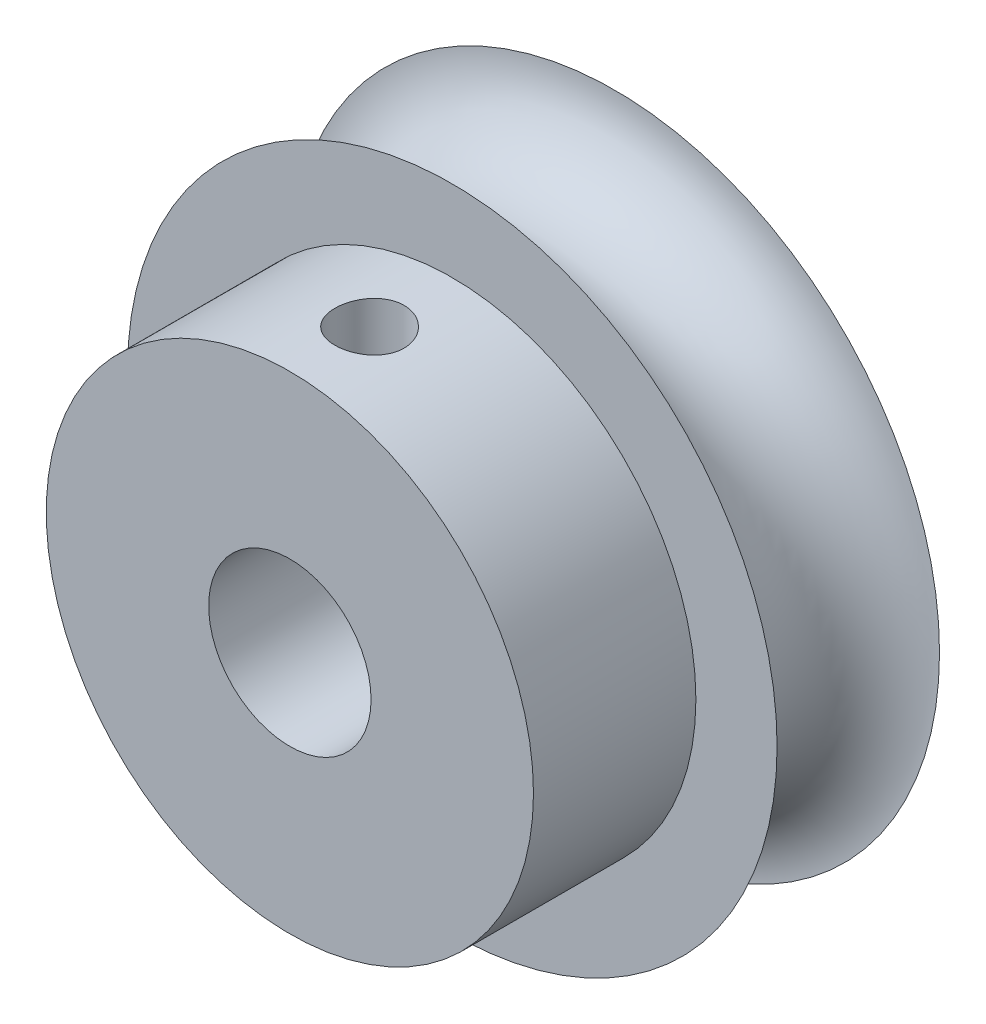
ISO-10303-21;
HEADER;
FILE_DESCRIPTION(('STEP AP214'),'2;1');
FILE_NAME('part.step','',(''),(''),'','','');
FILE_SCHEMA(('AUTOMOTIVE_DESIGN { 1 0 10303 214 1 1 1 1 }'));
ENDSEC;
DATA;
#1=APPLICATION_CONTEXT('core data for automotive mechanical design processes');
#2=APPLICATION_PROTOCOL_DEFINITION('international standard','automotive_design',2000,#1);
#3=PRODUCT_CONTEXT('',#1,'mechanical');
#4=PRODUCT('Part','Part','',(#3));
#5=PRODUCT_RELATED_PRODUCT_CATEGORY('part','',(#4));
#6=PRODUCT_DEFINITION_FORMATION('','',#4);
#7=PRODUCT_DEFINITION_CONTEXT('part definition',#1,'design');
#8=PRODUCT_DEFINITION('design','',#6,#7);
#9=PRODUCT_DEFINITION_SHAPE('','',#8);
#10=(LENGTH_UNIT() NAMED_UNIT(*) SI_UNIT(.MILLI.,.METRE.));
#11=(NAMED_UNIT(*) PLANE_ANGLE_UNIT() SI_UNIT($,.RADIAN.));
#12=(NAMED_UNIT(*) SI_UNIT($,.STERADIAN.) SOLID_ANGLE_UNIT());
#13=UNCERTAINTY_MEASURE_WITH_UNIT(LENGTH_MEASURE(1.E-05),#10,'distance_accuracy_value','');
#14=(GEOMETRIC_REPRESENTATION_CONTEXT(3) GLOBAL_UNCERTAINTY_ASSIGNED_CONTEXT((#13)) GLOBAL_UNIT_ASSIGNED_CONTEXT((#10,
#11,#12)) REPRESENTATION_CONTEXT('',''));
#15=CARTESIAN_POINT('',(0.,0.,0.));
#16=DIRECTION('',(0.,0.,1.));
#17=DIRECTION('',(1.,0.,0.));
#18=AXIS2_PLACEMENT_3D('',#15,#16,#17);
#19=CARTESIAN_POINT('',(0.,0.,6.35));
#20=DIRECTION('',(0.,0.,1.));
#21=DIRECTION('',(1.,0.,0.));
#22=AXIS2_PLACEMENT_3D('',#19,#20,#21);
#23=PLANE('',#22);
#24=CARTESIAN_POINT('',(0.,0.,6.35));
#25=DIRECTION('',(0.,0.,-1.));
#26=DIRECTION('',(-1.,0.,0.));
#27=AXIS2_PLACEMENT_3D('',#24,#25,#26);
#28=CIRCLE('',#27,12.7);
#29=CARTESIAN_POINT('',(-12.7,0.,6.35));
#30=VERTEX_POINT('',#29);
#31=EDGE_CURVE('E51',#30,#30,#28,.T.);
#32=ORIENTED_EDGE('',*,*,#31,.F.);
#33=EDGE_LOOP('',(#32));
#34=FACE_BOUND('',#33,.T.);
#35=CARTESIAN_POINT('',(0.,0.,6.35));
#36=DIRECTION('',(0.,0.,1.));
#37=DIRECTION('',(1.,0.,0.));
#38=AXIS2_PLACEMENT_3D('',#35,#36,#37);
#39=CIRCLE('',#38,9.525);
#40=CARTESIAN_POINT('',(9.525,0.,6.35));
#41=VERTEX_POINT('',#40);
#42=EDGE_CURVE('E39',#41,#41,#39,.T.);
#43=ORIENTED_EDGE('',*,*,#42,.F.);
#44=EDGE_LOOP('',(#43));
#45=FACE_BOUND('',#44,.T.);
#46=ADVANCED_FACE('F35',(#34,#45),#23,.T.);
#47=CARTESIAN_POINT('',(0.,0.,0.));
#48=DIRECTION('',(0.,0.,1.));
#49=DIRECTION('',(1.,0.,0.));
#50=AXIS2_PLACEMENT_3D('',#47,#48,#49);
#51=PLANE('',#50);
#52=CARTESIAN_POINT('',(0.,0.,0.));
#53=DIRECTION('',(0.,0.,1.));
#54=DIRECTION('',(1.,0.,0.));
#55=AXIS2_PLACEMENT_3D('',#52,#53,#54);
#56=CIRCLE('',#55,3.175);
#57=CARTESIAN_POINT('',(3.175,0.,0.));
#58=VERTEX_POINT('',#57);
#59=EDGE_CURVE('E46',#58,#58,#56,.T.);
#60=ORIENTED_EDGE('',*,*,#59,.T.);
#61=EDGE_LOOP('',(#60));
#62=FACE_BOUND('',#61,.T.);
#63=CARTESIAN_POINT('',(0.,0.,0.));
#64=DIRECTION('',(0.,0.,-1.));
#65=DIRECTION('',(-1.,0.,0.));
#66=AXIS2_PLACEMENT_3D('',#63,#64,#65);
#67=CIRCLE('',#66,12.7);
#68=CARTESIAN_POINT('',(-12.7,0.,0.));
#69=VERTEX_POINT('',#68);
#70=EDGE_CURVE('E56',#69,#69,#67,.T.);
#71=ORIENTED_EDGE('',*,*,#70,.T.);
#72=EDGE_LOOP('',(#71));
#73=FACE_BOUND('',#72,.T.);
#74=ADVANCED_FACE('F37',(#62,#73),#51,.F.);
#75=CARTESIAN_POINT('',(0.,0.,12.7));
#76=DIRECTION('',(0.,0.,-1.));
#77=DIRECTION('',(-1.,0.,0.));
#78=AXIS2_PLACEMENT_3D('',#75,#76,#77);
#79=CYLINDRICAL_SURFACE('',#78,9.525);
#80=CARTESIAN_POINT('',(-1.35255009270989,9.42847990116702,9.58400460400663));
#81=CARTESIAN_POINT('',(-1.35254693846715,9.42848111046918,9.5084433362623));
#82=CARTESIAN_POINT('',(-1.34619676177158,9.4293980626598,9.43283706135525));
#83=CARTESIAN_POINT('',(-1.32096869667658,9.4329646859939,9.28373507057906));
#84=CARTESIAN_POINT('',(-1.30207829311546,9.43561608808193,9.21024153975478));
#85=CARTESIAN_POINT('',(-1.25234347946995,9.44234538590909,9.0675450153106));
#86=CARTESIAN_POINT('',(-1.22150788275105,9.44642222971768,8.99833890192684));
#87=CARTESIAN_POINT('',(-1.14877814524653,9.45554179913665,8.86609405733709));
#88=CARTESIAN_POINT('',(-1.10688565122425,9.46058438088382,8.80305440964081));
#89=CARTESIAN_POINT('',(-1.01290948818475,9.47110779325562,8.68446808434494));
#90=CARTESIAN_POINT('',(-0.960762073230853,9.47659123135175,8.62897214880148));
#91=CARTESIAN_POINT('',(-0.847893886727079,9.48735518340646,8.5274878296197));
#92=CARTESIAN_POINT('',(-0.787172659682213,9.49263568656488,8.48149995142945));
#93=CARTESIAN_POINT('',(-0.658557318398418,9.50242590458439,8.400151567609));
#94=CARTESIAN_POINT('',(-0.590633526175638,9.50693221265855,8.36483753923889));
#95=CARTESIAN_POINT('',(-0.449744297325332,9.51463749086842,8.3061373511054));
#96=CARTESIAN_POINT('',(-0.376779100244347,9.51783652307055,8.2827506250483));
#97=CARTESIAN_POINT('',(-0.228399840892504,9.52254841884056,8.24872203840637));
#98=CARTESIAN_POINT('',(-0.153005588058797,9.52407249681117,8.23799537803051));
#99=CARTESIAN_POINT('',(-0.00147287604436838,9.52530115179799,8.22932827404425));
#100=CARTESIAN_POINT('',(0.0746655456718537,9.52500581994444,8.23138719003251));
#101=CARTESIAN_POINT('',(0.224947296219498,9.52263792940472,8.24816552162981));
#102=CARTESIAN_POINT('',(0.299101039704169,9.5205781761171,8.26279371725338));
#103=CARTESIAN_POINT('',(0.443890503746703,9.51492716435656,8.30415238152139));
#104=CARTESIAN_POINT('',(0.514526141490254,9.51133586985099,8.3308831349042));
#105=CARTESIAN_POINT('',(0.650552544834916,9.50300323893434,8.39578273450817));
#106=CARTESIAN_POINT('',(0.715924567373995,9.49825801542973,8.43399034590589));
#107=CARTESIAN_POINT('',(0.839363664351052,9.48814708187628,8.52073082264658));
#108=CARTESIAN_POINT('',(0.897430306921664,9.48278133518033,8.5692642979609));
#109=CARTESIAN_POINT('',(1.00514746449209,9.47197263737987,8.67578792675001));
#110=CARTESIAN_POINT('',(1.05471927051547,9.46652942267589,8.73385767759411));
#111=CARTESIAN_POINT('',(1.14342595646068,9.45622559782111,8.85753402667301));
#112=CARTESIAN_POINT('',(1.18256078410114,9.4513649905888,8.92314066265955));
#113=CARTESIAN_POINT('',(1.24929115517922,9.44277685690805,9.06010643690655));
#114=CARTESIAN_POINT('',(1.27687921633361,9.43905006559601,9.13146926956471));
#115=CARTESIAN_POINT('',(1.3196569492765,9.43316495943708,9.27787994404604));
#116=CARTESIAN_POINT('',(1.33484740003354,9.43100654604657,9.35292755403254));
#117=CARTESIAN_POINT('',(1.35229202792863,9.42852106412669,9.50387891627146));
#118=CARTESIAN_POINT('',(1.35465750546683,9.42817823977389,9.579769556007));
#119=CARTESIAN_POINT('',(1.34667980757659,9.42932097762504,9.73086408673779));
#120=CARTESIAN_POINT('',(1.33633698425126,9.43080648917211,9.80606799670179));
#121=CARTESIAN_POINT('',(1.30333044841799,9.43542407983107,9.95331333026075));
#122=CARTESIAN_POINT('',(1.28072165694148,9.43854881724156,10.0253673152452));
#123=CARTESIAN_POINT('',(1.22388189187727,9.44608676489324,10.1646625105313));
#124=CARTESIAN_POINT('',(1.18965039961865,9.45050003263472,10.2319035058877));
#125=CARTESIAN_POINT('',(1.11026741526152,9.46015511298294,10.3601644997131));
#126=CARTESIAN_POINT('',(1.06504355552116,9.46540233316635,10.4211392946103));
#127=CARTESIAN_POINT('',(0.965060750217577,9.47611757708666,10.5346735272422));
#128=CARTESIAN_POINT('',(0.910301323070151,9.48158561196488,10.5872325396887));
#129=CARTESIAN_POINT('',(0.792312969559356,9.49217533998935,10.6828400006298));
#130=CARTESIAN_POINT('',(0.729024148486467,9.49729415855077,10.7258148984773));
#131=CARTESIAN_POINT('',(0.596061256642967,9.50656462516135,10.8005229939891));
#132=CARTESIAN_POINT('',(0.526387345544061,9.51071629738671,10.8322564726708));
#133=CARTESIAN_POINT('',(0.382866680679765,9.51757204403391,10.883462069964));
#134=CARTESIAN_POINT('',(0.309034791443283,9.52028095300328,10.9029751769115));
#135=CARTESIAN_POINT('',(0.159101183858937,9.52396617596915,10.9293190277545));
#136=CARTESIAN_POINT('',(0.0829995994777587,9.52494259201949,10.9361505186715));
#137=CARTESIAN_POINT('',(-0.0685981949874696,9.52505197569194,10.9369204343478));
#138=CARTESIAN_POINT('',(-0.14409384487245,9.52420107556954,10.9309716878067));
#139=CARTESIAN_POINT('',(-0.293000135246534,9.52078379847999,10.9065908585486));
#140=CARTESIAN_POINT('',(-0.36641078046267,9.5182174254024,10.8881588041355));
#141=CARTESIAN_POINT('',(-0.509037658531627,9.51165619548858,10.839373087832));
#142=CARTESIAN_POINT('',(-0.57825632915021,9.50766217838441,10.8090264330111));
#143=CARTESIAN_POINT('',(-0.710636955823985,9.49868555342592,10.7372848146385));
#144=CARTESIAN_POINT('',(-0.773798756689101,9.49370292025115,10.6958895681009));
#145=CARTESIAN_POINT('',(-0.89284652742803,9.4832513624238,10.6028144868393));
#146=CARTESIAN_POINT('',(-0.94866684280091,9.47777870059525,10.5510510894704));
#147=CARTESIAN_POINT('',(-1.05087076535073,9.4669923288291,10.4388846013012));
#148=CARTESIAN_POINT('',(-1.097252149489,9.46167865658719,10.3784794809107));
#149=CARTESIAN_POINT('',(-1.17946722793213,9.45178345308636,10.2503910808099));
#150=CARTESIAN_POINT('',(-1.21524697596167,9.44720571881809,10.1826728911631));
#151=CARTESIAN_POINT('',(-1.27487274150615,9.43934515269288,10.0421573740581));
#152=CARTESIAN_POINT('',(-1.2987313464289,9.43606095578301,9.9693654968211));
#153=CARTESIAN_POINT('',(-1.32832120877019,9.43193131708686,9.84419163801121));
#154=CARTESIAN_POINT('',(-1.33739342696784,9.43064375498016,9.79258874256621));
#155=CARTESIAN_POINT('',(-1.34950892834484,9.42891763283372,9.68866595953124));
#156=CARTESIAN_POINT('',(-1.35255227766159,9.42847906348045,9.63634607981301));
#157=CARTESIAN_POINT('',(-1.35255009270989,9.42847990116702,9.58400460400663));
#158=B_SPLINE_CURVE_WITH_KNOTS('',3,(#80,#81,#82,#83,#84,#85,#86,#87,#88,#89,#90,#91,#92,#93,
#94,#95,#96,#97,#98,#99,#100,#101,#102,#103,#104,#105,#106,#107,#108,#109,#110,#111,#112,#113,
#114,#115,#116,#117,#118,#119,#120,#121,#122,#123,#124,#125,#126,#127,#128,#129,#130,#131,#132,
#133,#134,#135,#136,#137,#138,#139,#140,#141,#142,#143,#144,#145,#146,#147,#148,#149,#150,#151,
#152,#153,#154,#155,#156,#157),.UNSPECIFIED.,.T.,.F.,(4,2,2,2,2,2,2,2,2,2,2,2,2,2,2,2,2,2,2,2,2,
2,2,2,2,2,2,2,2,2,2,2,2,2,2,2,2,2,4),(0.,0.226492525357348,0.453211431037403,0.679763377299386,
0.906281600979635,1.13425513351163,1.36224078199609,1.59120530524858,1.82015895653336,
2.04757016383838,2.27496998070947,2.50073327771484,2.72650188655724,2.95304181271712,
3.17959512480304,3.40814571525351,3.63669745054819,3.86539705850333,4.09408229566362,
4.32077969315946,4.54747080979546,4.77315519161292,4.9988496460733,5.22607222836521,
5.45330628963436,5.68222838295625,5.91114475319332,6.13928914424409,6.36742009582667,
6.59354530345003,6.81966999837115,7.04566190631614,7.27165960311529,7.49955787137885,
7.72750975183908,7.95660239137873,8.18545262054526,8.34234627046142,8.49923819922618),.UNSPECIFIED.);
#159=CARTESIAN_POINT('',(-1.35255009270989,9.42847990116702,9.58400460400663));
#160=VERTEX_POINT('',#159);
#161=EDGE_CURVE('E59',#160,#160,#158,.T.);
#162=ORIENTED_EDGE('',*,*,#161,.T.);
#163=EDGE_LOOP('',(#162));
#164=FACE_BOUND('',#163,.T.);
#165=CARTESIAN_POINT('',(0.,0.,12.7));
#166=DIRECTION('',(0.,0.,1.));
#167=DIRECTION('',(1.,0.,0.));
#168=AXIS2_PLACEMENT_3D('',#165,#166,#167);
#169=CIRCLE('',#168,9.525);
#170=CARTESIAN_POINT('',(9.525,0.,12.7));
#171=VERTEX_POINT('',#170);
#172=EDGE_CURVE('E10',#171,#171,#169,.T.);
#173=ORIENTED_EDGE('',*,*,#172,.F.);
#174=EDGE_LOOP('',(#173));
#175=FACE_BOUND('',#174,.T.);
#176=ORIENTED_EDGE('',*,*,#42,.T.);
#177=EDGE_LOOP('',(#176));
#178=FACE_BOUND('',#177,.T.);
#179=ADVANCED_FACE('F70',(#164,#175,#178),#79,.T.);
#180=CARTESIAN_POINT('',(0.,0.,12.7));
#181=DIRECTION('',(0.,0.,1.));
#182=DIRECTION('',(1.,0.,0.));
#183=AXIS2_PLACEMENT_3D('',#180,#181,#182);
#184=PLANE('',#183);
#185=CARTESIAN_POINT('',(0.,0.,12.7));
#186=DIRECTION('',(0.,0.,1.));
#187=DIRECTION('',(1.,0.,0.));
#188=AXIS2_PLACEMENT_3D('',#185,#186,#187);
#189=CIRCLE('',#188,3.175);
#190=CARTESIAN_POINT('',(3.175,0.,12.7));
#191=VERTEX_POINT('',#190);
#192=EDGE_CURVE('E48',#191,#191,#189,.T.);
#193=ORIENTED_EDGE('',*,*,#192,.F.);
#194=EDGE_LOOP('',(#193));
#195=FACE_BOUND('',#194,.T.);
#196=ORIENTED_EDGE('',*,*,#172,.T.);
#197=EDGE_LOOP('',(#196));
#198=FACE_BOUND('',#197,.T.);
#199=ADVANCED_FACE('F86',(#195,#198),#184,.T.);
#200=CARTESIAN_POINT('',(0.,0.,0.));
#201=DIRECTION('',(0.,0.,1.));
#202=DIRECTION('',(1.,0.,0.));
#203=AXIS2_PLACEMENT_3D('',#200,#201,#202);
#204=CYLINDRICAL_SURFACE('',#203,3.175);
#205=CARTESIAN_POINT('',(-1.35255002824514,2.87249602629735,9.58400460400663));
#206=CARTESIAN_POINT('',(-1.35254147798341,2.87250444485055,9.65597900396945));
#207=CARTESIAN_POINT('',(-1.34676857008594,2.8752407723016,9.72806394695058));
#208=CARTESIAN_POINT('',(-1.3239047513934,2.88583585872094,9.87014340940796));
#209=CARTESIAN_POINT('',(-1.3067837562811,2.89370823271908,9.94013185408833));
#210=CARTESIAN_POINT('',(-1.26202142622316,2.91350624447307,10.0757018296451));
#211=CARTESIAN_POINT('',(-1.23442429788146,2.92541482813467,10.1413005343379));
#212=CARTESIAN_POINT('',(-1.16962322079396,2.95191922203411,10.2669190646687));
#213=CARTESIAN_POINT('',(-1.13242124197793,2.96651448106587,10.3269400308576));
#214=CARTESIAN_POINT('',(-1.04687755983788,2.9978097120729,10.44364213988));
#215=CARTESIAN_POINT('',(-0.998007680592962,3.01458308045744,10.4999166322262));
#216=CARTESIAN_POINT('',(-0.89162344903594,3.04774272673313,10.6037734459216));
#217=CARTESIAN_POINT('',(-0.834105690932889,3.06412884916002,10.6513523262516));
#218=CARTESIAN_POINT('',(-0.708832231693186,3.09556678281032,10.7385749788029));
#219=CARTESIAN_POINT('',(-0.640728776355468,3.1105233906504,10.7777567350845));
#220=CARTESIAN_POINT('',(-0.498144298297837,3.13651335741469,10.8439301772692));
#221=CARTESIAN_POINT('',(-0.423666247402295,3.14754853227458,10.8709275071));
#222=CARTESIAN_POINT('',(-0.274720561165464,3.16393094806255,10.9104780223909));
#223=CARTESIAN_POINT('',(-0.200470374852572,3.16955362477518,10.9237336621071));
#224=CARTESIAN_POINT('',(-0.0506011581038712,3.17548089781803,10.9376988567757));
#225=CARTESIAN_POINT('',(0.0250172767065115,3.17578775500594,10.9384137454048));
#226=CARTESIAN_POINT('',(0.170351414197783,3.17120780350814,10.9276353554566));
#227=CARTESIAN_POINT('',(0.240136794739658,3.16664987966993,10.9169151754442));
#228=CARTESIAN_POINT('',(0.376807778691675,3.15330893301697,10.8849021741898));
#229=CARTESIAN_POINT('',(0.443693167508213,3.14452559810993,10.8636085719825));
#230=CARTESIAN_POINT('',(0.573900189563373,3.1234090612129,10.8108065995998));
#231=CARTESIAN_POINT('',(0.637151644870316,3.11102360511324,10.7791469361552));
#232=CARTESIAN_POINT('',(0.757610382096001,3.08390487651114,10.7066639741755));
#233=CARTESIAN_POINT('',(0.814815488621588,3.06917076374402,10.6658373939041));
#234=CARTESIAN_POINT('',(0.926009795325771,3.03755046010548,10.5727078029601));
#235=CARTESIAN_POINT('',(0.979456966512721,3.02058568607612,10.5197834259302));
#236=CARTESIAN_POINT('',(1.07695819092783,2.98721397000219,10.4057019468082));
#237=CARTESIAN_POINT('',(1.12100828499023,2.97080726552018,10.3445413922921));
#238=CARTESIAN_POINT('',(1.19994678811981,2.93983314831236,10.212978610203));
#239=CARTESIAN_POINT('',(1.23445240004513,2.92535220661795,10.1423245684517));
#240=CARTESIAN_POINT('',(1.29085200554058,2.90091054573935,9.99542862415197));
#241=CARTESIAN_POINT('',(1.31275549116586,2.89094642564035,9.91919097615743));
#242=CARTESIAN_POINT('',(1.3419165216658,2.87752108259912,9.76873200737965));
#243=CARTESIAN_POINT('',(1.35005607302452,2.87366931228245,9.6947171611599));
#244=CARTESIAN_POINT('',(1.35405862557262,2.87178660474119,9.54629482049383));
#245=CARTESIAN_POINT('',(1.34992620494561,2.87375349680453,9.47188748280885));
#246=CARTESIAN_POINT('',(1.3303079290309,2.88288153260984,9.33015002818828));
#247=CARTESIAN_POINT('',(1.31561624491243,2.88967898376709,9.26268349793335));
#248=CARTESIAN_POINT('',(1.27636168958672,2.90722970885296,9.1312352096801));
#249=CARTESIAN_POINT('',(1.25179644056565,2.91798393562429,9.0672542953274));
#250=CARTESIAN_POINT('',(1.19231801182952,2.94280150665391,8.941496920931));
#251=CARTESIAN_POINT('',(1.15700326021568,2.95698784647966,8.87993546005407));
#252=CARTESIAN_POINT('',(1.07742173710712,2.98690354970051,8.76330796793857));
#253=CARTESIAN_POINT('',(1.03315097041576,3.00263360011266,8.70824485297159));
#254=CARTESIAN_POINT('',(0.932439214264054,3.03549304451212,8.60125496019942));
#255=CARTESIAN_POINT('',(0.875279779068489,3.0526266616624,8.5500030370907));
#256=CARTESIAN_POINT('',(0.752783422423605,3.08511805536416,8.4576876700277));
#257=CARTESIAN_POINT('',(0.687445732600736,3.10047566479278,8.41662518448672));
#258=CARTESIAN_POINT('',(0.549837436882865,3.12781707037912,8.34582872453534));
#259=CARTESIAN_POINT('',(0.477537727834337,3.13978579987814,8.31614513920578));
#260=CARTESIAN_POINT('',(0.328327355068334,3.15887131793663,8.26958844648017));
#261=CARTESIAN_POINT('',(0.251419606351412,3.16599113933735,8.25270733078557));
#262=CARTESIAN_POINT('',(0.101193665907357,3.17421351475421,8.23327618010317));
#263=CARTESIAN_POINT('',(0.0280194288549399,3.17571486492476,8.22977594981682));
#264=CARTESIAN_POINT('',(-0.117854069119752,3.17364964964133,8.23462534290088));
#265=CARTESIAN_POINT('',(-0.190553417511031,3.17008404550882,8.24297271849889));
#266=CARTESIAN_POINT('',(-0.330533477564983,3.15849994638112,8.27059833035726));
#267=CARTESIAN_POINT('',(-0.397915077212932,3.15065734731309,8.28944537653519));
#268=CARTESIAN_POINT('',(-0.528526265394841,3.13139696958913,8.33705393297267));
#269=CARTESIAN_POINT('',(-0.591755081650267,3.11997852821091,8.36581728115192));
#270=CARTESIAN_POINT('',(-0.715443796894189,3.09401690300587,8.43389987294285));
#271=CARTESIAN_POINT('',(-0.775646373760899,3.07935507557223,8.47364026921886));
#272=CARTESIAN_POINT('',(-0.888788698107364,3.04862631282276,8.56194728598735));
#273=CARTESIAN_POINT('',(-0.941725594227777,3.03255882989576,8.61051735433261));
#274=CARTESIAN_POINT('',(-1.04278400422397,2.99937579665836,8.71920077293248));
#275=CARTESIAN_POINT('',(-1.09028888957728,2.98226762244456,8.77989179606745));
#276=CARTESIAN_POINT('',(-1.1745444364235,2.95010374458276,8.90889590128646));
#277=CARTESIAN_POINT('',(-1.21128889940016,2.93504922659519,8.9772133453814));
#278=CARTESIAN_POINT('',(-1.27268143424379,2.90895550984775,9.11960133822321));
#279=CARTESIAN_POINT('',(-1.29736105664765,2.89790585784353,9.19365628828597));
#280=CARTESIAN_POINT('',(-1.33359547547175,2.88141655969737,9.34535827346221));
#281=CARTESIAN_POINT('',(-1.34519429534395,2.87595810211085,9.4229923391416));
#282=CARTESIAN_POINT('',(-1.35170310878156,2.87289345534071,9.52863060318497));
#283=CARTESIAN_POINT('',(-1.35255331831875,2.87249278690415,9.55630941981982));
#284=CARTESIAN_POINT('',(-1.35255002824514,2.87249602629735,9.58400460400663));
#285=B_SPLINE_CURVE_WITH_KNOTS('',3,(#205,#206,#207,#208,#209,#210,#211,#212,#213,#214,#215,
#216,#217,#218,#219,#220,#221,#222,#223,#224,#225,#226,#227,#228,#229,#230,#231,#232,#233,#234,
#235,#236,#237,#238,#239,#240,#241,#242,#243,#244,#245,#246,#247,#248,#249,#250,#251,#252,#253,
#254,#255,#256,#257,#258,#259,#260,#261,#262,#263,#264,#265,#266,#267,#268,#269,#270,#271,#272,
#273,#274,#275,#276,#277,#278,#279,#280,#281,#282,#283,#284),.UNSPECIFIED.,.T.,.F.,(4,2,2,2,2,2,
2,2,2,2,2,2,2,2,2,2,2,2,2,2,2,2,2,2,2,2,2,2,2,2,2,2,2,2,2,2,2,2,2,4),(0.,0.215841017024482,
0.432256539765402,0.647768816797231,0.863236927888207,1.09143146099038,1.3197161004133,
1.55843359843098,1.79704040674267,2.02273771494572,2.24833903004246,2.45960046429092,
2.67087750487629,2.88538690608464,3.09997322398205,3.33026922190857,3.56066205708487,
3.79927211992555,4.03770222305693,4.26017678293179,4.48256835684311,4.68978076943019,
4.89704311413887,5.11326891832658,5.3295913924151,5.56448124604251,5.79939318492192,
6.03533368522679,6.27112647621924,6.48982581152622,6.70848365991785,6.91876136736693,
7.12907806934213,7.34897495931779,7.5689579008499,7.80469983588876,8.040577303592,
8.2758345882162,8.51029772917061,8.59335165841003),.UNSPECIFIED.);
#286=CARTESIAN_POINT('',(-1.35255002824514,2.87249602629735,9.58400460400663));
#287=VERTEX_POINT('',#286);
#288=EDGE_CURVE('E66',#287,#287,#285,.T.);
#289=ORIENTED_EDGE('',*,*,#288,.T.);
#290=EDGE_LOOP('',(#289));
#291=FACE_BOUND('',#290,.T.);
#292=ORIENTED_EDGE('',*,*,#59,.F.);
#293=EDGE_LOOP('',(#292));
#294=FACE_BOUND('',#293,.T.);
#295=ORIENTED_EDGE('',*,*,#192,.T.);
#296=EDGE_LOOP('',(#295));
#297=FACE_BOUND('',#296,.T.);
#298=ADVANCED_FACE('F83',(#291,#294,#297),#204,.F.);
#299=CARTESIAN_POINT('',(0.,0.,3.175));
#300=DIRECTION('',(0.,0.,-1.));
#301=DIRECTION('',(-1.,0.,0.));
#302=AXIS2_PLACEMENT_3D('',#299,#300,#301);
#303=TOROIDAL_SURFACE('',#302,12.7,3.175);
#304=ORIENTED_EDGE('',*,*,#31,.T.);
#305=EDGE_LOOP('',(#304));
#306=FACE_BOUND('',#305,.T.);
#307=ORIENTED_EDGE('',*,*,#70,.F.);
#308=EDGE_LOOP('',(#307));
#309=FACE_BOUND('',#308,.T.);
#310=ADVANCED_FACE('F76',(#306,#309),#303,.F.);
#311=CARTESIAN_POINT('',(-9.36589770240009E-08,9.525,9.58400460400663));
#312=DIRECTION('',(-9.8329633936891E-09,1.,0.));
#313=DIRECTION('',(-1.,-9.8329633936891E-09,0.));
#314=AXIS2_PLACEMENT_3D('',#311,#312,#313);
#315=CYLINDRICAL_SURFACE('',#314,1.35254999999999);
#316=ORIENTED_EDGE('',*,*,#288,.F.);
#317=EDGE_LOOP('',(#316));
#318=FACE_BOUND('',#317,.T.);
#319=ORIENTED_EDGE('',*,*,#161,.F.);
#320=EDGE_LOOP('',(#319));
#321=FACE_BOUND('',#320,.T.);
#322=ADVANCED_FACE('F73',(#318,#321),#315,.F.);
#323=CLOSED_SHELL('',(#46,#74,#179,#199,#298,#310,#322));
#324=MANIFOLD_SOLID_BREP('B2',#323);
#325=ADVANCED_BREP_SHAPE_REPRESENTATION('',(#18,#324),#14);
#326=SHAPE_DEFINITION_REPRESENTATION(#9,#325);
ENDSEC;
END-ISO-10303-21;
